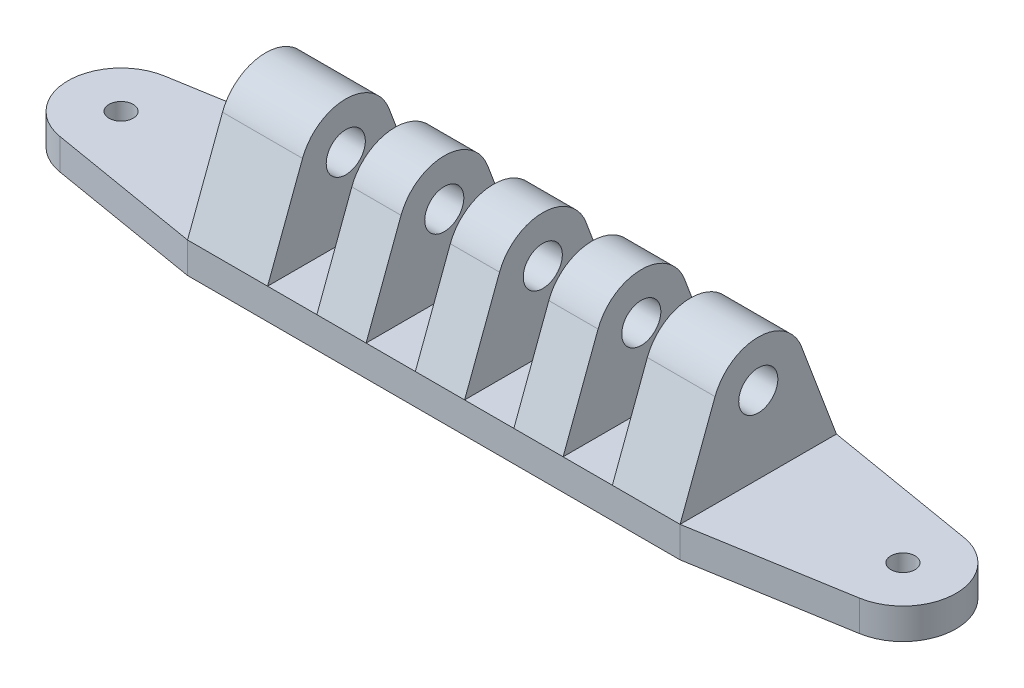
ISO-10303-21;
HEADER;
FILE_DESCRIPTION(('STEP AP214'),'2;1');
FILE_NAME('part.step','',(''),(''),'','','');
FILE_SCHEMA(('AUTOMOTIVE_DESIGN { 1 0 10303 214 1 1 1 1 }'));
ENDSEC;
DATA;
#1=APPLICATION_CONTEXT('core data for automotive mechanical design processes');
#2=APPLICATION_PROTOCOL_DEFINITION('international standard','automotive_design',2000,#1);
#3=PRODUCT_CONTEXT('',#1,'mechanical');
#4=PRODUCT('Part','Part','',(#3));
#5=PRODUCT_RELATED_PRODUCT_CATEGORY('part','',(#4));
#6=PRODUCT_DEFINITION_FORMATION('','',#4);
#7=PRODUCT_DEFINITION_CONTEXT('part definition',#1,'design');
#8=PRODUCT_DEFINITION('design','',#6,#7);
#9=PRODUCT_DEFINITION_SHAPE('','',#8);
#10=(LENGTH_UNIT() NAMED_UNIT(*) SI_UNIT(.MILLI.,.METRE.));
#11=(NAMED_UNIT(*) PLANE_ANGLE_UNIT() SI_UNIT($,.RADIAN.));
#12=(NAMED_UNIT(*) SI_UNIT($,.STERADIAN.) SOLID_ANGLE_UNIT());
#13=UNCERTAINTY_MEASURE_WITH_UNIT(LENGTH_MEASURE(1.E-05),#10,'distance_accuracy_value','');
#14=(GEOMETRIC_REPRESENTATION_CONTEXT(3) GLOBAL_UNCERTAINTY_ASSIGNED_CONTEXT((#13)) GLOBAL_UNIT_ASSIGNED_CONTEXT((#10,
#11,#12)) REPRESENTATION_CONTEXT('',''));
#15=CARTESIAN_POINT('',(0.,0.,0.));
#16=DIRECTION('',(0.,0.,1.));
#17=DIRECTION('',(1.,0.,0.));
#18=AXIS2_PLACEMENT_3D('',#15,#16,#17);
#19=CARTESIAN_POINT('',(160.,10.,-50.8));
#20=DIRECTION('',(0.,0.351258844539416,-0.9362783902947));
#21=DIRECTION('',(0.,0.9362783902947,0.351258844539416));
#22=AXIS2_PLACEMENT_3D('',#19,#20,#21);
#23=PLANE('',#22);
#24=DIRECTION('',(0.,-0.9362783902947,-0.351258844539416));
#25=VECTOR('',#24,1.);
#26=CARTESIAN_POINT('',(138.,10.,-50.8));
#27=LINE('',#26,#25);
#28=CARTESIAN_POINT('',(138.,40.2688826680912,-39.4441758544205));
#29=VERTEX_POINT('',#28);
#30=CARTESIAN_POINT('',(138.,10.,-50.8));
#31=VERTEX_POINT('',#30);
#32=EDGE_CURVE('E365',#29,#31,#27,.T.);
#33=ORIENTED_EDGE('',*,*,#32,.F.);
#34=DIRECTION('',(-1.,0.,0.));
#35=VECTOR('',#34,1.);
#36=CARTESIAN_POINT('',(160.,40.2688826680912,-39.4441758544205));
#37=LINE('',#36,#35);
#38=CARTESIAN_POINT('',(160.,40.2688826680912,-39.4441758544205));
#39=VERTEX_POINT('',#38);
#40=EDGE_CURVE('E392',#39,#29,#37,.T.);
#41=ORIENTED_EDGE('',*,*,#40,.F.);
#42=DIRECTION('',(0.,-0.9362783902947,-0.351258844539416));
#43=VECTOR('',#42,1.);
#44=CARTESIAN_POINT('',(160.,10.,-50.8));
#45=LINE('',#44,#43);
#46=CARTESIAN_POINT('',(160.,10.,-50.8));
#47=VERTEX_POINT('',#46);
#48=EDGE_CURVE('E381',#39,#47,#45,.T.);
#49=ORIENTED_EDGE('',*,*,#48,.T.);
#50=DIRECTION('',(-1.,0.,0.));
#51=VECTOR('',#50,1.);
#52=CARTESIAN_POINT('',(0.,10.,-50.8));
#53=LINE('',#52,#51);
#54=EDGE_CURVE('E408',#47,#31,#53,.T.);
#55=ORIENTED_EDGE('',*,*,#54,.T.);
#56=EDGE_LOOP('',(#33,#41,#49,#55));
#57=FACE_BOUND('',#56,.T.);
#58=ADVANCED_FACE('F37',(#57),#23,.T.);
#59=DIRECTION('',(0.,0.9362783902947,0.351258844539416));
#60=VECTOR('',#59,1.);
#61=CARTESIAN_POINT('',(122.,9.99999999999999,-50.8));
#62=LINE('',#61,#60);
#63=CARTESIAN_POINT('',(122.,10.,-50.8));
#64=VERTEX_POINT('',#63);
#65=CARTESIAN_POINT('',(122.,40.2688826680912,-39.4441758544205));
#66=VERTEX_POINT('',#65);
#67=EDGE_CURVE('E358',#64,#66,#62,.T.);
#68=ORIENTED_EDGE('',*,*,#67,.F.);
#69=CARTESIAN_POINT('',(106.,10.,-50.8));
#70=VERTEX_POINT('',#69);
#71=EDGE_CURVE('E412',#64,#70,#53,.T.);
#72=ORIENTED_EDGE('',*,*,#71,.T.);
#73=DIRECTION('',(0.,-0.9362783902947,-0.351258844539416));
#74=VECTOR('',#73,1.);
#75=CARTESIAN_POINT('',(106.,9.99999999999998,-50.8));
#76=LINE('',#75,#74);
#77=CARTESIAN_POINT('',(106.,40.2688826680912,-39.4441758544205));
#78=VERTEX_POINT('',#77);
#79=EDGE_CURVE('E351',#78,#70,#76,.T.);
#80=ORIENTED_EDGE('',*,*,#79,.F.);
#81=EDGE_CURVE('E396',#66,#78,#37,.T.);
#82=ORIENTED_EDGE('',*,*,#81,.F.);
#83=EDGE_LOOP('',(#68,#72,#80,#82));
#84=FACE_BOUND('',#83,.T.);
#85=ADVANCED_FACE('F456',(#84),#23,.T.);
#86=DIRECTION('',(0.,0.9362783902947,0.351258844539416));
#87=VECTOR('',#86,1.);
#88=CARTESIAN_POINT('',(90.,9.99999999999998,-50.8));
#89=LINE('',#88,#87);
#90=CARTESIAN_POINT('',(90.,10.,-50.8));
#91=VERTEX_POINT('',#90);
#92=CARTESIAN_POINT('',(90.,40.2688826680912,-39.4441758544205));
#93=VERTEX_POINT('',#92);
#94=EDGE_CURVE('E343',#91,#93,#89,.T.);
#95=ORIENTED_EDGE('',*,*,#94,.F.);
#96=CARTESIAN_POINT('',(74.,10.,-50.8));
#97=VERTEX_POINT('',#96);
#98=EDGE_CURVE('E510',#91,#97,#53,.T.);
#99=ORIENTED_EDGE('',*,*,#98,.T.);
#100=DIRECTION('',(0.,-0.9362783902947,-0.351258844539416));
#101=VECTOR('',#100,1.);
#102=CARTESIAN_POINT('',(74.,9.99999999999997,-50.8));
#103=LINE('',#102,#101);
#104=CARTESIAN_POINT('',(74.,40.2688826680912,-39.4441758544205));
#105=VERTEX_POINT('',#104);
#106=EDGE_CURVE('E336',#105,#97,#103,.T.);
#107=ORIENTED_EDGE('',*,*,#106,.F.);
#108=EDGE_CURVE('E525',#93,#105,#37,.T.);
#109=ORIENTED_EDGE('',*,*,#108,.F.);
#110=EDGE_LOOP('',(#95,#99,#107,#109));
#111=FACE_BOUND('',#110,.T.);
#112=ADVANCED_FACE('F463',(#111),#23,.T.);
#113=DIRECTION('',(0.,0.9362783902947,0.351258844539416));
#114=VECTOR('',#113,1.);
#115=CARTESIAN_POINT('',(58.,9.99999999999997,-50.8));
#116=LINE('',#115,#114);
#117=CARTESIAN_POINT('',(58.,10.,-50.8));
#118=VERTEX_POINT('',#117);
#119=CARTESIAN_POINT('',(58.,40.2688826680912,-39.4441758544205));
#120=VERTEX_POINT('',#119);
#121=EDGE_CURVE('E328',#118,#120,#116,.T.);
#122=ORIENTED_EDGE('',*,*,#121,.F.);
#123=CARTESIAN_POINT('',(42.,10.,-50.8));
#124=VERTEX_POINT('',#123);
#125=EDGE_CURVE('E499',#118,#124,#53,.T.);
#126=ORIENTED_EDGE('',*,*,#125,.T.);
#127=DIRECTION('',(0.,-0.9362783902947,-0.351258844539416));
#128=VECTOR('',#127,1.);
#129=CARTESIAN_POINT('',(42.,9.99999999999996,-50.8));
#130=LINE('',#129,#128);
#131=CARTESIAN_POINT('',(42.,40.2688826680912,-39.4441758544205));
#132=VERTEX_POINT('',#131);
#133=EDGE_CURVE('E320',#132,#124,#130,.T.);
#134=ORIENTED_EDGE('',*,*,#133,.F.);
#135=EDGE_CURVE('E501',#120,#132,#37,.T.);
#136=ORIENTED_EDGE('',*,*,#135,.F.);
#137=EDGE_LOOP('',(#122,#126,#134,#136));
#138=FACE_BOUND('',#137,.T.);
#139=ADVANCED_FACE('F472',(#138),#23,.T.);
#140=CARTESIAN_POINT('',(160.,35.,-25.4));
#141=DIRECTION('',(-1.,0.,0.));
#142=DIRECTION('',(0.,0.,1.));
#143=AXIS2_PLACEMENT_3D('',#140,#141,#142);
#144=CYLINDRICAL_SURFACE('',#143,15.);
#145=CARTESIAN_POINT('',(138.,35.,-25.4));
#146=DIRECTION('',(1.,0.,0.));
#147=DIRECTION('',(0.,0.,-1.));
#148=AXIS2_PLACEMENT_3D('',#145,#146,#147);
#149=CIRCLE('',#148,15.);
#150=CARTESIAN_POINT('',(138.,40.2688826680912,-11.3558241455795));
#151=VERTEX_POINT('',#150);
#152=EDGE_CURVE('E363',#151,#29,#149,.F.);
#153=ORIENTED_EDGE('',*,*,#152,.F.);
#154=DIRECTION('',(-1.,0.,0.));
#155=VECTOR('',#154,1.);
#156=CARTESIAN_POINT('',(160.,40.2688826680912,-11.3558241455795));
#157=LINE('',#156,#155);
#158=CARTESIAN_POINT('',(160.,40.2688826680912,-11.3558241455795));
#159=VERTEX_POINT('',#158);
#160=EDGE_CURVE('E398',#159,#151,#157,.T.);
#161=ORIENTED_EDGE('',*,*,#160,.F.);
#162=CARTESIAN_POINT('',(160.,35.,-25.4));
#163=DIRECTION('',(-1.,0.,0.));
#164=DIRECTION('',(0.,0.,-1.));
#165=AXIS2_PLACEMENT_3D('',#162,#163,#164);
#166=CIRCLE('',#165,15.);
#167=EDGE_CURVE('E377',#159,#39,#166,.T.);
#168=ORIENTED_EDGE('',*,*,#167,.T.);
#169=ORIENTED_EDGE('',*,*,#40,.T.);
#170=EDGE_LOOP('',(#153,#161,#168,#169));
#171=FACE_BOUND('',#170,.T.);
#172=ADVANCED_FACE('F479',(#171),#144,.T.);
#173=CARTESIAN_POINT('',(122.,40.2688826680912,-11.3558241455795));
#174=VERTEX_POINT('',#173);
#175=CARTESIAN_POINT('',(106.,40.2688826680912,-11.3558241455795));
#176=VERTEX_POINT('',#175);
#177=EDGE_CURVE('E401',#174,#176,#157,.T.);
#178=ORIENTED_EDGE('',*,*,#177,.F.);
#179=CARTESIAN_POINT('',(122.,35.,-25.4));
#180=DIRECTION('',(-1.,0.,0.));
#181=DIRECTION('',(0.,-1.,0.));
#182=AXIS2_PLACEMENT_3D('',#179,#180,#181);
#183=CIRCLE('',#182,15.);
#184=EDGE_CURVE('E356',#66,#174,#183,.F.);
#185=ORIENTED_EDGE('',*,*,#184,.F.);
#186=ORIENTED_EDGE('',*,*,#81,.T.);
#187=CARTESIAN_POINT('',(106.,35.,-25.4));
#188=DIRECTION('',(1.,0.,0.));
#189=DIRECTION('',(0.,1.,0.));
#190=AXIS2_PLACEMENT_3D('',#187,#188,#189);
#191=CIRCLE('',#190,15.);
#192=EDGE_CURVE('E349',#176,#78,#191,.F.);
#193=ORIENTED_EDGE('',*,*,#192,.F.);
#194=EDGE_LOOP('',(#178,#185,#186,#193));
#195=FACE_BOUND('',#194,.T.);
#196=ADVANCED_FACE('F491',(#195),#144,.T.);
#197=CARTESIAN_POINT('',(90.,40.2688826680912,-11.3558241455795));
#198=VERTEX_POINT('',#197);
#199=CARTESIAN_POINT('',(74.,40.2688826680912,-11.3558241455795));
#200=VERTEX_POINT('',#199);
#201=EDGE_CURVE('E559',#198,#200,#157,.T.);
#202=ORIENTED_EDGE('',*,*,#201,.F.);
#203=CARTESIAN_POINT('',(90.,35.,-25.4));
#204=DIRECTION('',(-1.,0.,0.));
#205=DIRECTION('',(0.,-1.,0.));
#206=AXIS2_PLACEMENT_3D('',#203,#204,#205);
#207=CIRCLE('',#206,15.);
#208=EDGE_CURVE('E341',#93,#198,#207,.F.);
#209=ORIENTED_EDGE('',*,*,#208,.F.);
#210=ORIENTED_EDGE('',*,*,#108,.T.);
#211=CARTESIAN_POINT('',(74.,35.,-25.4));
#212=DIRECTION('',(1.,0.,0.));
#213=DIRECTION('',(0.,1.,0.));
#214=AXIS2_PLACEMENT_3D('',#211,#212,#213);
#215=CIRCLE('',#214,15.);
#216=EDGE_CURVE('E334',#200,#105,#215,.F.);
#217=ORIENTED_EDGE('',*,*,#216,.F.);
#218=EDGE_LOOP('',(#202,#209,#210,#217));
#219=FACE_BOUND('',#218,.T.);
#220=ADVANCED_FACE('F557',(#219),#144,.T.);
#221=CARTESIAN_POINT('',(58.,40.2688826680912,-11.3558241455795));
#222=VERTEX_POINT('',#221);
#223=CARTESIAN_POINT('',(42.,40.2688826680912,-11.3558241455795));
#224=VERTEX_POINT('',#223);
#225=EDGE_CURVE('E562',#222,#224,#157,.T.);
#226=ORIENTED_EDGE('',*,*,#225,.F.);
#227=CARTESIAN_POINT('',(58.,35.,-25.4));
#228=DIRECTION('',(-1.,0.,0.));
#229=DIRECTION('',(0.,-1.,0.));
#230=AXIS2_PLACEMENT_3D('',#227,#228,#229);
#231=CIRCLE('',#230,15.);
#232=EDGE_CURVE('E326',#120,#222,#231,.F.);
#233=ORIENTED_EDGE('',*,*,#232,.F.);
#234=ORIENTED_EDGE('',*,*,#135,.T.);
#235=CARTESIAN_POINT('',(42.,35.,-25.4));
#236=DIRECTION('',(1.,0.,0.));
#237=DIRECTION('',(0.,1.,0.));
#238=AXIS2_PLACEMENT_3D('',#235,#236,#237);
#239=CIRCLE('',#238,15.);
#240=EDGE_CURVE('E318',#224,#132,#239,.F.);
#241=ORIENTED_EDGE('',*,*,#240,.F.);
#242=EDGE_LOOP('',(#226,#233,#234,#241));
#243=FACE_BOUND('',#242,.T.);
#244=ADVANCED_FACE('F480',(#243),#144,.T.);
#245=CARTESIAN_POINT('',(160.,10.,0.));
#246=DIRECTION('',(0.,0.351258844539416,0.9362783902947));
#247=DIRECTION('',(0.,-0.9362783902947,0.351258844539416));
#248=AXIS2_PLACEMENT_3D('',#245,#246,#247);
#249=PLANE('',#248);
#250=DIRECTION('',(0.,0.9362783902947,-0.351258844539416));
#251=VECTOR('',#250,1.);
#252=CARTESIAN_POINT('',(138.,10.,0.));
#253=LINE('',#252,#251);
#254=CARTESIAN_POINT('',(138.,10.,0.));
#255=VERTEX_POINT('',#254);
#256=EDGE_CURVE('E360',#255,#151,#253,.T.);
#257=ORIENTED_EDGE('',*,*,#256,.F.);
#258=DIRECTION('',(1.,0.,0.));
#259=VECTOR('',#258,1.);
#260=CARTESIAN_POINT('',(0.,10.,0.));
#261=LINE('',#260,#259);
#262=CARTESIAN_POINT('',(160.,10.,0.));
#263=VERTEX_POINT('',#262);
#264=EDGE_CURVE('E407',#255,#263,#261,.T.);
#265=ORIENTED_EDGE('',*,*,#264,.T.);
#266=DIRECTION('',(0.,0.9362783902947,-0.351258844539416));
#267=VECTOR('',#266,1.);
#268=CARTESIAN_POINT('',(160.,10.,0.));
#269=LINE('',#268,#267);
#270=EDGE_CURVE('E374',#263,#159,#269,.T.);
#271=ORIENTED_EDGE('',*,*,#270,.T.);
#272=ORIENTED_EDGE('',*,*,#160,.T.);
#273=EDGE_LOOP('',(#257,#265,#271,#272));
#274=FACE_BOUND('',#273,.T.);
#275=ADVANCED_FACE('F602',(#274),#249,.T.);
#276=DIRECTION('',(0.,-0.9362783902947,0.351258844539416));
#277=VECTOR('',#276,1.);
#278=CARTESIAN_POINT('',(122.,9.99999999999999,0.));
#279=LINE('',#278,#277);
#280=CARTESIAN_POINT('',(122.,10.,0.));
#281=VERTEX_POINT('',#280);
#282=EDGE_CURVE('E354',#174,#281,#279,.T.);
#283=ORIENTED_EDGE('',*,*,#282,.F.);
#284=ORIENTED_EDGE('',*,*,#177,.T.);
#285=DIRECTION('',(0.,0.9362783902947,-0.351258844539416));
#286=VECTOR('',#285,1.);
#287=CARTESIAN_POINT('',(106.,9.99999999999998,0.));
#288=LINE('',#287,#286);
#289=CARTESIAN_POINT('',(106.,10.,0.));
#290=VERTEX_POINT('',#289);
#291=EDGE_CURVE('E346',#290,#176,#288,.T.);
#292=ORIENTED_EDGE('',*,*,#291,.F.);
#293=EDGE_CURVE('E589',#290,#281,#261,.T.);
#294=ORIENTED_EDGE('',*,*,#293,.T.);
#295=EDGE_LOOP('',(#283,#284,#292,#294));
#296=FACE_BOUND('',#295,.T.);
#297=ADVANCED_FACE('F864',(#296),#249,.T.);
#298=DIRECTION('',(0.,-0.9362783902947,0.351258844539416));
#299=VECTOR('',#298,1.);
#300=CARTESIAN_POINT('',(90.,9.99999999999998,0.));
#301=LINE('',#300,#299);
#302=CARTESIAN_POINT('',(90.,10.,0.));
#303=VERTEX_POINT('',#302);
#304=EDGE_CURVE('E339',#198,#303,#301,.T.);
#305=ORIENTED_EDGE('',*,*,#304,.F.);
#306=ORIENTED_EDGE('',*,*,#201,.T.);
#307=DIRECTION('',(0.,0.9362783902947,-0.351258844539416));
#308=VECTOR('',#307,1.);
#309=CARTESIAN_POINT('',(74.,9.99999999999997,0.));
#310=LINE('',#309,#308);
#311=CARTESIAN_POINT('',(74.,10.,0.));
#312=VERTEX_POINT('',#311);
#313=EDGE_CURVE('E331',#312,#200,#310,.T.);
#314=ORIENTED_EDGE('',*,*,#313,.F.);
#315=EDGE_CURVE('E584',#312,#303,#261,.T.);
#316=ORIENTED_EDGE('',*,*,#315,.T.);
#317=EDGE_LOOP('',(#305,#306,#314,#316));
#318=FACE_BOUND('',#317,.T.);
#319=ADVANCED_FACE('F913',(#318),#249,.T.);
#320=DIRECTION('',(0.,-0.9362783902947,0.351258844539416));
#321=VECTOR('',#320,1.);
#322=CARTESIAN_POINT('',(58.,9.99999999999997,0.));
#323=LINE('',#322,#321);
#324=CARTESIAN_POINT('',(58.,10.,0.));
#325=VERTEX_POINT('',#324);
#326=EDGE_CURVE('E323',#222,#325,#323,.T.);
#327=ORIENTED_EDGE('',*,*,#326,.F.);
#328=ORIENTED_EDGE('',*,*,#225,.T.);
#329=DIRECTION('',(0.,0.9362783902947,-0.351258844539416));
#330=VECTOR('',#329,1.);
#331=CARTESIAN_POINT('',(42.,9.99999999999996,0.));
#332=LINE('',#331,#330);
#333=CARTESIAN_POINT('',(42.,10.,0.));
#334=VERTEX_POINT('',#333);
#335=EDGE_CURVE('E315',#334,#224,#332,.T.);
#336=ORIENTED_EDGE('',*,*,#335,.F.);
#337=EDGE_CURVE('E580',#334,#325,#261,.T.);
#338=ORIENTED_EDGE('',*,*,#337,.T.);
#339=EDGE_LOOP('',(#327,#328,#336,#338));
#340=FACE_BOUND('',#339,.T.);
#341=ADVANCED_FACE('F746',(#340),#249,.T.);
#342=CARTESIAN_POINT('',(160.,35.,-25.4));
#343=DIRECTION('',(-1.,0.,0.));
#344=DIRECTION('',(0.,0.,1.));
#345=AXIS2_PLACEMENT_3D('',#342,#343,#344);
#346=CYLINDRICAL_SURFACE('',#345,6.35);
#347=CARTESIAN_POINT('',(138.,35.,-25.4));
#348=DIRECTION('',(1.,0.,0.));
#349=DIRECTION('',(0.,0.,-1.));
#350=AXIS2_PLACEMENT_3D('',#347,#348,#349);
#351=CIRCLE('',#350,6.35);
#352=CARTESIAN_POINT('',(138.,35.,-31.75));
#353=VERTEX_POINT('',#352);
#354=EDGE_CURVE('E41',#353,#353,#351,.F.);
#355=ORIENTED_EDGE('',*,*,#354,.T.);
#356=EDGE_LOOP('',(#355));
#357=FACE_BOUND('',#356,.T.);
#358=CARTESIAN_POINT('',(160.,35.,-25.4));
#359=DIRECTION('',(-1.,0.,0.));
#360=DIRECTION('',(0.,0.,1.));
#361=AXIS2_PLACEMENT_3D('',#358,#359,#360);
#362=CIRCLE('',#361,6.35);
#363=CARTESIAN_POINT('',(160.,35.,-19.05));
#364=VERTEX_POINT('',#363);
#365=EDGE_CURVE('E368',#364,#364,#362,.T.);
#366=ORIENTED_EDGE('',*,*,#365,.F.);
#367=EDGE_LOOP('',(#366));
#368=FACE_BOUND('',#367,.T.);
#369=ADVANCED_FACE('F759',(#357,#368),#346,.F.);
#370=CARTESIAN_POINT('',(0.,10.,0.));
#371=DIRECTION('',(1.,0.,0.));
#372=DIRECTION('',(0.,0.,-1.));
#373=AXIS2_PLACEMENT_3D('',#370,#371,#372);
#374=PLANE('',#373);
#375=DIRECTION('',(0.,-0.9362783902947,-0.351258844539416));
#376=VECTOR('',#375,1.);
#377=CARTESIAN_POINT('',(0.,10.,-50.8));
#378=LINE('',#377,#376);
#379=CARTESIAN_POINT('',(0.,40.2688826680912,-39.4441758544205));
#380=VERTEX_POINT('',#379);
#381=CARTESIAN_POINT('',(0.,10.,-50.8));
#382=VERTEX_POINT('',#381);
#383=EDGE_CURVE('E378',#380,#382,#378,.T.);
#384=ORIENTED_EDGE('',*,*,#383,.T.);
#385=DIRECTION('',(0.,0.,1.));
#386=VECTOR('',#385,1.);
#387=CARTESIAN_POINT('',(0.,10.,0.));
#388=LINE('',#387,#386);
#389=CARTESIAN_POINT('',(0.,10.,0.));
#390=VERTEX_POINT('',#389);
#391=EDGE_CURVE('E233',#382,#390,#388,.T.);
#392=ORIENTED_EDGE('',*,*,#391,.T.);
#393=DIRECTION('',(0.,0.9362783902947,-0.351258844539416));
#394=VECTOR('',#393,1.);
#395=CARTESIAN_POINT('',(0.,10.,0.));
#396=LINE('',#395,#394);
#397=CARTESIAN_POINT('',(0.,40.2688826680912,-11.3558241455795));
#398=VERTEX_POINT('',#397);
#399=EDGE_CURVE('E371',#390,#398,#396,.T.);
#400=ORIENTED_EDGE('',*,*,#399,.T.);
#401=CARTESIAN_POINT('',(0.,35.,-25.4));
#402=DIRECTION('',(-1.,0.,0.));
#403=DIRECTION('',(0.,0.,-1.));
#404=AXIS2_PLACEMENT_3D('',#401,#402,#403);
#405=CIRCLE('',#404,15.);
#406=EDGE_CURVE('E387',#398,#380,#405,.T.);
#407=ORIENTED_EDGE('',*,*,#406,.T.);
#408=EDGE_LOOP('',(#384,#392,#400,#407));
#409=FACE_BOUND('',#408,.T.);
#410=CARTESIAN_POINT('',(0.,35.,-25.4));
#411=DIRECTION('',(-1.,0.,0.));
#412=DIRECTION('',(0.,0.,1.));
#413=AXIS2_PLACEMENT_3D('',#410,#411,#412);
#414=CIRCLE('',#413,6.35);
#415=CARTESIAN_POINT('',(0.,35.,-19.05));
#416=VERTEX_POINT('',#415);
#417=EDGE_CURVE('E367',#416,#416,#414,.T.);
#418=ORIENTED_EDGE('',*,*,#417,.F.);
#419=EDGE_LOOP('',(#418));
#420=FACE_BOUND('',#419,.T.);
#421=ADVANCED_FACE('F39',(#409,#420),#374,.F.);
#422=CARTESIAN_POINT('',(0.,10.,0.));
#423=DIRECTION('',(0.,0.,-1.));
#424=DIRECTION('',(-1.,0.,0.));
#425=AXIS2_PLACEMENT_3D('',#422,#423,#424);
#426=PLANE('',#425);
#427=DIRECTION('',(1.,0.,0.));
#428=VECTOR('',#427,1.);
#429=CARTESIAN_POINT('',(0.,0.,0.));
#430=LINE('',#429,#428);
#431=CARTESIAN_POINT('',(0.,0.,0.));
#432=VERTEX_POINT('',#431);
#433=CARTESIAN_POINT('',(160.,0.,0.));
#434=VERTEX_POINT('',#433);
#435=EDGE_CURVE('E395',#432,#434,#430,.T.);
#436=ORIENTED_EDGE('',*,*,#435,.T.);
#437=DIRECTION('',(0.,-1.,0.));
#438=VECTOR('',#437,1.);
#439=CARTESIAN_POINT('',(160.,10.,0.));
#440=LINE('',#439,#438);
#441=EDGE_CURVE('E46',#263,#434,#440,.T.);
#442=ORIENTED_EDGE('',*,*,#441,.F.);
#443=ORIENTED_EDGE('',*,*,#264,.F.);
#444=EDGE_CURVE('E591',#281,#255,#261,.T.);
#445=ORIENTED_EDGE('',*,*,#444,.F.);
#446=ORIENTED_EDGE('',*,*,#293,.F.);
#447=EDGE_CURVE('E549',#303,#290,#261,.T.);
#448=ORIENTED_EDGE('',*,*,#447,.F.);
#449=ORIENTED_EDGE('',*,*,#315,.F.);
#450=EDGE_CURVE('E583',#325,#312,#261,.T.);
#451=ORIENTED_EDGE('',*,*,#450,.F.);
#452=ORIENTED_EDGE('',*,*,#337,.F.);
#453=CARTESIAN_POINT('',(26.,10.,0.));
#454=VERTEX_POINT('',#453);
#455=EDGE_CURVE('E406',#454,#334,#261,.T.);
#456=ORIENTED_EDGE('',*,*,#455,.F.);
#457=EDGE_CURVE('E402',#390,#454,#261,.T.);
#458=ORIENTED_EDGE('',*,*,#457,.F.);
#459=DIRECTION('',(0.,-1.,0.));
#460=VECTOR('',#459,1.);
#461=CARTESIAN_POINT('',(0.,10.,0.));
#462=LINE('',#461,#460);
#463=EDGE_CURVE('E11',#390,#432,#462,.T.);
#464=ORIENTED_EDGE('',*,*,#463,.T.);
#465=EDGE_LOOP('',(#436,#442,#443,#445,#446,#448,#449,#451,#452,#456,#458,#464));
#466=FACE_BOUND('',#465,.T.);
#467=ADVANCED_FACE('F577',(#466),#426,.F.);
#468=CARTESIAN_POINT('',(160.,10.,0.));
#469=DIRECTION('',(-1.,0.,0.));
#470=DIRECTION('',(0.,0.,1.));
#471=AXIS2_PLACEMENT_3D('',#468,#469,#470);
#472=PLANE('',#471);
#473=ORIENTED_EDGE('',*,*,#270,.F.);
#474=DIRECTION('',(0.,0.,-1.));
#475=VECTOR('',#474,1.);
#476=CARTESIAN_POINT('',(160.,10.,0.));
#477=LINE('',#476,#475);
#478=EDGE_CURVE('E254',#263,#47,#477,.T.);
#479=ORIENTED_EDGE('',*,*,#478,.T.);
#480=ORIENTED_EDGE('',*,*,#48,.F.);
#481=ORIENTED_EDGE('',*,*,#167,.F.);
#482=EDGE_LOOP('',(#473,#479,#480,#481));
#483=FACE_BOUND('',#482,.T.);
#484=ORIENTED_EDGE('',*,*,#365,.T.);
#485=EDGE_LOOP('',(#484));
#486=FACE_BOUND('',#485,.T.);
#487=ADVANCED_FACE('F609',(#483,#486),#472,.F.);
#488=CARTESIAN_POINT('',(0.,10.,-50.8));
#489=DIRECTION('',(0.,0.,1.));
#490=DIRECTION('',(1.,0.,0.));
#491=AXIS2_PLACEMENT_3D('',#488,#489,#490);
#492=PLANE('',#491);
#493=DIRECTION('',(-1.,0.,0.));
#494=VECTOR('',#493,1.);
#495=CARTESIAN_POINT('',(0.,0.,-50.8));
#496=LINE('',#495,#494);
#497=CARTESIAN_POINT('',(160.,0.,-50.8));
#498=VERTEX_POINT('',#497);
#499=CARTESIAN_POINT('',(0.,0.,-50.8));
#500=VERTEX_POINT('',#499);
#501=EDGE_CURVE('E415',#498,#500,#496,.T.);
#502=ORIENTED_EDGE('',*,*,#501,.T.);
#503=DIRECTION('',(0.,-1.,0.));
#504=VECTOR('',#503,1.);
#505=CARTESIAN_POINT('',(0.,10.,-50.8));
#506=LINE('',#505,#504);
#507=EDGE_CURVE('E411',#382,#500,#506,.T.);
#508=ORIENTED_EDGE('',*,*,#507,.F.);
#509=CARTESIAN_POINT('',(26.,10.,-50.8));
#510=VERTEX_POINT('',#509);
#511=EDGE_CURVE('E405',#510,#382,#53,.T.);
#512=ORIENTED_EDGE('',*,*,#511,.F.);
#513=DIRECTION('',(-1.,0.,0.));
#514=VECTOR('',#513,1.);
#515=CARTESIAN_POINT('',(42.,10.,-50.8));
#516=LINE('',#515,#514);
#517=EDGE_CURVE('E277',#124,#510,#516,.T.);
#518=ORIENTED_EDGE('',*,*,#517,.F.);
#519=ORIENTED_EDGE('',*,*,#125,.F.);
#520=DIRECTION('',(-1.,0.,0.));
#521=VECTOR('',#520,1.);
#522=CARTESIAN_POINT('',(74.,10.,-50.8));
#523=LINE('',#522,#521);
#524=EDGE_CURVE('E293',#97,#118,#523,.T.);
#525=ORIENTED_EDGE('',*,*,#524,.F.);
#526=ORIENTED_EDGE('',*,*,#98,.F.);
#527=DIRECTION('',(-1.,0.,0.));
#528=VECTOR('',#527,1.);
#529=CARTESIAN_POINT('',(106.,10.,-50.8));
#530=LINE('',#529,#528);
#531=EDGE_CURVE('E286',#70,#91,#530,.T.);
#532=ORIENTED_EDGE('',*,*,#531,.F.);
#533=ORIENTED_EDGE('',*,*,#71,.F.);
#534=DIRECTION('',(-1.,0.,0.));
#535=VECTOR('',#534,1.);
#536=CARTESIAN_POINT('',(138.,10.,-50.8));
#537=LINE('',#536,#535);
#538=EDGE_CURVE('E279',#31,#64,#537,.T.);
#539=ORIENTED_EDGE('',*,*,#538,.F.);
#540=ORIENTED_EDGE('',*,*,#54,.F.);
#541=DIRECTION('',(0.,-1.,0.));
#542=VECTOR('',#541,1.);
#543=CARTESIAN_POINT('',(160.,10.,-50.8));
#544=LINE('',#543,#542);
#545=EDGE_CURVE('E419',#47,#498,#544,.T.);
#546=ORIENTED_EDGE('',*,*,#545,.T.);
#547=EDGE_LOOP('',(#502,#508,#512,#518,#519,#525,#526,#532,#533,#539,#540,#546));
#548=FACE_BOUND('',#547,.T.);
#549=ADVANCED_FACE('F481',(#548),#492,.F.);
#550=CARTESIAN_POINT('',(0.,0.,0.));
#551=DIRECTION('',(0.,-1.,0.));
#552=DIRECTION('',(0.,0.,-1.));
#553=AXIS2_PLACEMENT_3D('',#550,#551,#552);
#554=PLANE('',#553);
#555=ORIENTED_EDGE('',*,*,#435,.F.);
#556=DIRECTION('',(-0.986105834069172,0.,-0.166118283204295));
#557=VECTOR('',#556,1.);
#558=CARTESIAN_POINT('',(0.,0.,0.));
#559=LINE('',#558,#557);
#560=CARTESIAN_POINT('',(-49.8638009399252,0.,-8.40000000000006));
#561=VERTEX_POINT('',#560);
#562=EDGE_CURVE('E240',#432,#561,#559,.T.);
#563=ORIENTED_EDGE('',*,*,#562,.T.);
#564=CARTESIAN_POINT('',(-47.,0.,-25.4000000000001));
#565=DIRECTION('',(0.,-1.,0.));
#566=DIRECTION('',(0.,0.,-1.));
#567=AXIS2_PLACEMENT_3D('',#564,#565,#566);
#568=CIRCLE('',#567,17.2395288747551);
#569=CARTESIAN_POINT('',(-49.8638009399252,0.,-42.4));
#570=VERTEX_POINT('',#569);
#571=EDGE_CURVE('E218',#561,#570,#568,.T.);
#572=ORIENTED_EDGE('',*,*,#571,.T.);
#573=DIRECTION('',(0.986105834069172,0.,-0.166118283204293));
#574=VECTOR('',#573,1.);
#575=CARTESIAN_POINT('',(0.,0.,-50.8));
#576=LINE('',#575,#574);
#577=EDGE_CURVE('E235',#570,#500,#576,.T.);
#578=ORIENTED_EDGE('',*,*,#577,.T.);
#579=ORIENTED_EDGE('',*,*,#501,.F.);
#580=DIRECTION('',(0.986105834069172,0.,0.166118283204293));
#581=VECTOR('',#580,1.);
#582=CARTESIAN_POINT('',(160.,0.,-50.8));
#583=LINE('',#582,#581);
#584=CARTESIAN_POINT('',(209.863800939925,0.,-42.4));
#585=VERTEX_POINT('',#584);
#586=EDGE_CURVE('E251',#498,#585,#583,.T.);
#587=ORIENTED_EDGE('',*,*,#586,.T.);
#588=CARTESIAN_POINT('',(207.,0.,-25.4000000000001));
#589=DIRECTION('',(0.,-1.,0.));
#590=DIRECTION('',(0.,0.,1.));
#591=AXIS2_PLACEMENT_3D('',#588,#589,#590);
#592=CIRCLE('',#591,17.2395288747551);
#593=CARTESIAN_POINT('',(209.863800939925,0.,-8.40000000000006));
#594=VERTEX_POINT('',#593);
#595=EDGE_CURVE('E270',#585,#594,#592,.T.);
#596=ORIENTED_EDGE('',*,*,#595,.T.);
#597=DIRECTION('',(-0.986105834069172,0.,0.166118283204295));
#598=VECTOR('',#597,1.);
#599=CARTESIAN_POINT('',(160.,0.,0.));
#600=LINE('',#599,#598);
#601=EDGE_CURVE('E258',#594,#434,#600,.T.);
#602=ORIENTED_EDGE('',*,*,#601,.T.);
#603=EDGE_LOOP('',(#555,#563,#572,#578,#579,#587,#596,#602));
#604=FACE_BOUND('',#603,.T.);
#605=CARTESIAN_POINT('',(207.,0.,-25.4000000000001));
#606=DIRECTION('',(0.,-1.,0.));
#607=DIRECTION('',(0.,0.,1.));
#608=AXIS2_PLACEMENT_3D('',#605,#606,#607);
#609=CIRCLE('',#608,3.9243);
#610=CARTESIAN_POINT('',(207.,0.,-21.4757000000001));
#611=VERTEX_POINT('',#610);
#612=EDGE_CURVE('E246',#611,#611,#609,.T.);
#613=ORIENTED_EDGE('',*,*,#612,.F.);
#614=EDGE_LOOP('',(#613));
#615=FACE_BOUND('',#614,.T.);
#616=CARTESIAN_POINT('',(-47.,0.,-25.4000000000001));
#617=DIRECTION('',(0.,-1.,0.));
#618=DIRECTION('',(0.,0.,-1.));
#619=AXIS2_PLACEMENT_3D('',#616,#617,#618);
#620=CIRCLE('',#619,3.9243);
#621=CARTESIAN_POINT('',(-47.,0.,-29.3243000000001));
#622=VERTEX_POINT('',#621);
#623=EDGE_CURVE('E702',#622,#622,#620,.T.);
#624=ORIENTED_EDGE('',*,*,#623,.F.);
#625=EDGE_LOOP('',(#624));
#626=FACE_BOUND('',#625,.T.);
#627=ADVANCED_FACE('F470',(#604,#615,#626),#554,.T.);
#628=DIRECTION('',(0.,0.9362783902947,0.351258844539416));
#629=VECTOR('',#628,1.);
#630=CARTESIAN_POINT('',(26.,9.99999999999996,-50.8));
#631=LINE('',#630,#629);
#632=CARTESIAN_POINT('',(26.,40.2688826680912,-39.4441758544205));
#633=VERTEX_POINT('',#632);
#634=EDGE_CURVE('E312',#510,#633,#631,.T.);
#635=ORIENTED_EDGE('',*,*,#634,.F.);
#636=ORIENTED_EDGE('',*,*,#511,.T.);
#637=ORIENTED_EDGE('',*,*,#383,.F.);
#638=EDGE_CURVE('E397',#633,#380,#37,.T.);
#639=ORIENTED_EDGE('',*,*,#638,.F.);
#640=EDGE_LOOP('',(#635,#636,#637,#639));
#641=FACE_BOUND('',#640,.T.);
#642=ADVANCED_FACE('F459',(#641),#23,.T.);
#643=CARTESIAN_POINT('',(26.,40.2688826680912,-11.3558241455795));
#644=VERTEX_POINT('',#643);
#645=EDGE_CURVE('E384',#644,#398,#157,.T.);
#646=ORIENTED_EDGE('',*,*,#645,.F.);
#647=CARTESIAN_POINT('',(26.,35.,-25.4));
#648=DIRECTION('',(-1.,0.,0.));
#649=DIRECTION('',(0.,-1.,0.));
#650=AXIS2_PLACEMENT_3D('',#647,#648,#649);
#651=CIRCLE('',#650,15.);
#652=EDGE_CURVE('E310',#633,#644,#651,.F.);
#653=ORIENTED_EDGE('',*,*,#652,.F.);
#654=ORIENTED_EDGE('',*,*,#638,.T.);
#655=ORIENTED_EDGE('',*,*,#406,.F.);
#656=EDGE_LOOP('',(#646,#653,#654,#655));
#657=FACE_BOUND('',#656,.T.);
#658=ADVANCED_FACE('F469',(#657),#144,.T.);
#659=DIRECTION('',(0.,-0.9362783902947,0.351258844539416));
#660=VECTOR('',#659,1.);
#661=CARTESIAN_POINT('',(26.,9.99999999999996,0.));
#662=LINE('',#661,#660);
#663=EDGE_CURVE('E307',#644,#454,#662,.T.);
#664=ORIENTED_EDGE('',*,*,#663,.F.);
#665=ORIENTED_EDGE('',*,*,#645,.T.);
#666=ORIENTED_EDGE('',*,*,#399,.F.);
#667=ORIENTED_EDGE('',*,*,#457,.T.);
#668=EDGE_LOOP('',(#664,#665,#666,#667));
#669=FACE_BOUND('',#668,.T.);
#670=ADVANCED_FACE('F477',(#669),#249,.T.);
#671=CARTESIAN_POINT('',(26.,35.,-25.4));
#672=DIRECTION('',(-1.,0.,0.));
#673=DIRECTION('',(0.,-1.,0.));
#674=AXIS2_PLACEMENT_3D('',#671,#672,#673);
#675=CIRCLE('',#674,6.35);
#676=CARTESIAN_POINT('',(26.,28.65,-25.4));
#677=VERTEX_POINT('',#676);
#678=EDGE_CURVE('E283',#677,#677,#675,.F.);
#679=ORIENTED_EDGE('',*,*,#678,.T.);
#680=EDGE_LOOP('',(#679));
#681=FACE_BOUND('',#680,.T.);
#682=ORIENTED_EDGE('',*,*,#417,.T.);
#683=EDGE_LOOP('',(#682));
#684=FACE_BOUND('',#683,.T.);
#685=ADVANCED_FACE('F744',(#681,#684),#346,.F.);
#686=CARTESIAN_POINT('',(42.,10.,20.2));
#687=DIRECTION('',(1.,0.,0.));
#688=DIRECTION('',(0.,1.,0.));
#689=AXIS2_PLACEMENT_3D('',#686,#687,#688);
#690=PLANE('',#689);
#691=ORIENTED_EDGE('',*,*,#133,.T.);
#692=DIRECTION('',(0.,0.,-1.));
#693=VECTOR('',#692,1.);
#694=CARTESIAN_POINT('',(42.,10.,20.2));
#695=LINE('',#694,#693);
#696=EDGE_CURVE('E303',#334,#124,#695,.T.);
#697=ORIENTED_EDGE('',*,*,#696,.F.);
#698=ORIENTED_EDGE('',*,*,#335,.T.);
#699=ORIENTED_EDGE('',*,*,#240,.T.);
#700=EDGE_LOOP('',(#691,#697,#698,#699));
#701=FACE_BOUND('',#700,.T.);
#702=CARTESIAN_POINT('',(42.,35.,-25.4));
#703=DIRECTION('',(1.,0.,0.));
#704=DIRECTION('',(0.,1.,0.));
#705=AXIS2_PLACEMENT_3D('',#702,#703,#704);
#706=CIRCLE('',#705,6.35);
#707=CARTESIAN_POINT('',(42.,41.35,-25.4));
#708=VERTEX_POINT('',#707);
#709=EDGE_CURVE('E314',#708,#708,#706,.F.);
#710=ORIENTED_EDGE('',*,*,#709,.F.);
#711=EDGE_LOOP('',(#710));
#712=FACE_BOUND('',#711,.T.);
#713=ADVANCED_FACE('F757',(#701,#712),#690,.F.);
#714=CARTESIAN_POINT('',(26.,10.,20.2));
#715=DIRECTION('',(-1.,0.,0.));
#716=DIRECTION('',(0.,-1.,0.));
#717=AXIS2_PLACEMENT_3D('',#714,#715,#716);
#718=PLANE('',#717);
#719=ORIENTED_EDGE('',*,*,#634,.T.);
#720=ORIENTED_EDGE('',*,*,#652,.T.);
#721=ORIENTED_EDGE('',*,*,#663,.T.);
#722=DIRECTION('',(0.,0.,-1.));
#723=VECTOR('',#722,1.);
#724=CARTESIAN_POINT('',(26.,10.,20.2));
#725=LINE('',#724,#723);
#726=EDGE_CURVE('E297',#454,#510,#725,.T.);
#727=ORIENTED_EDGE('',*,*,#726,.T.);
#728=EDGE_LOOP('',(#719,#720,#721,#727));
#729=FACE_BOUND('',#728,.T.);
#730=ORIENTED_EDGE('',*,*,#678,.F.);
#731=EDGE_LOOP('',(#730));
#732=FACE_BOUND('',#731,.T.);
#733=ADVANCED_FACE('F573',(#729,#732),#718,.F.);
#734=CARTESIAN_POINT('',(42.,10.,20.2));
#735=DIRECTION('',(0.,-1.,0.));
#736=DIRECTION('',(0.,0.,-1.));
#737=AXIS2_PLACEMENT_3D('',#734,#735,#736);
#738=PLANE('',#737);
#739=ORIENTED_EDGE('',*,*,#455,.T.);
#740=ORIENTED_EDGE('',*,*,#696,.T.);
#741=ORIENTED_EDGE('',*,*,#517,.T.);
#742=ORIENTED_EDGE('',*,*,#726,.F.);
#743=EDGE_LOOP('',(#739,#740,#741,#742));
#744=FACE_BOUND('',#743,.T.);
#745=ADVANCED_FACE('F772',(#744),#738,.F.);
#746=CARTESIAN_POINT('',(58.,35.,-25.4));
#747=DIRECTION('',(-1.,0.,0.));
#748=DIRECTION('',(0.,-1.,0.));
#749=AXIS2_PLACEMENT_3D('',#746,#747,#748);
#750=CIRCLE('',#749,6.35);
#751=CARTESIAN_POINT('',(58.,28.65,-25.4));
#752=VERTEX_POINT('',#751);
#753=EDGE_CURVE('E322',#752,#752,#750,.F.);
#754=ORIENTED_EDGE('',*,*,#753,.T.);
#755=EDGE_LOOP('',(#754));
#756=FACE_BOUND('',#755,.T.);
#757=ORIENTED_EDGE('',*,*,#709,.T.);
#758=EDGE_LOOP('',(#757));
#759=FACE_BOUND('',#758,.T.);
#760=ADVANCED_FACE('F760',(#756,#759),#346,.F.);
#761=CARTESIAN_POINT('',(74.,10.,20.2));
#762=DIRECTION('',(1.,0.,0.));
#763=DIRECTION('',(0.,1.,0.));
#764=AXIS2_PLACEMENT_3D('',#761,#762,#763);
#765=PLANE('',#764);
#766=ORIENTED_EDGE('',*,*,#106,.T.);
#767=DIRECTION('',(0.,0.,-1.));
#768=VECTOR('',#767,1.);
#769=CARTESIAN_POINT('',(74.,10.,20.2));
#770=LINE('',#769,#768);
#771=EDGE_CURVE('E296',#312,#97,#770,.T.);
#772=ORIENTED_EDGE('',*,*,#771,.F.);
#773=ORIENTED_EDGE('',*,*,#313,.T.);
#774=ORIENTED_EDGE('',*,*,#216,.T.);
#775=EDGE_LOOP('',(#766,#772,#773,#774));
#776=FACE_BOUND('',#775,.T.);
#777=CARTESIAN_POINT('',(74.,35.,-25.4));
#778=DIRECTION('',(1.,0.,0.));
#779=DIRECTION('',(0.,1.,0.));
#780=AXIS2_PLACEMENT_3D('',#777,#778,#779);
#781=CIRCLE('',#780,6.35);
#782=CARTESIAN_POINT('',(74.,41.35,-25.4));
#783=VERTEX_POINT('',#782);
#784=EDGE_CURVE('E330',#783,#783,#781,.F.);
#785=ORIENTED_EDGE('',*,*,#784,.F.);
#786=EDGE_LOOP('',(#785));
#787=FACE_BOUND('',#786,.T.);
#788=ADVANCED_FACE('F785',(#776,#787),#765,.F.);
#789=CARTESIAN_POINT('',(58.,10.,20.2));
#790=DIRECTION('',(-1.,0.,0.));
#791=DIRECTION('',(0.,-1.,0.));
#792=AXIS2_PLACEMENT_3D('',#789,#790,#791);
#793=PLANE('',#792);
#794=ORIENTED_EDGE('',*,*,#121,.T.);
#795=ORIENTED_EDGE('',*,*,#232,.T.);
#796=ORIENTED_EDGE('',*,*,#326,.T.);
#797=DIRECTION('',(0.,0.,-1.));
#798=VECTOR('',#797,1.);
#799=CARTESIAN_POINT('',(58.,10.,20.2));
#800=LINE('',#799,#798);
#801=EDGE_CURVE('E289',#325,#118,#800,.T.);
#802=ORIENTED_EDGE('',*,*,#801,.T.);
#803=EDGE_LOOP('',(#794,#795,#796,#802));
#804=FACE_BOUND('',#803,.T.);
#805=ORIENTED_EDGE('',*,*,#753,.F.);
#806=EDGE_LOOP('',(#805));
#807=FACE_BOUND('',#806,.T.);
#808=ADVANCED_FACE('F793',(#804,#807),#793,.F.);
#809=CARTESIAN_POINT('',(74.,10.,20.2));
#810=DIRECTION('',(0.,-1.,0.));
#811=DIRECTION('',(0.,0.,-1.));
#812=AXIS2_PLACEMENT_3D('',#809,#810,#811);
#813=PLANE('',#812);
#814=ORIENTED_EDGE('',*,*,#450,.T.);
#815=ORIENTED_EDGE('',*,*,#771,.T.);
#816=ORIENTED_EDGE('',*,*,#524,.T.);
#817=ORIENTED_EDGE('',*,*,#801,.F.);
#818=EDGE_LOOP('',(#814,#815,#816,#817));
#819=FACE_BOUND('',#818,.T.);
#820=ADVANCED_FACE('F801',(#819),#813,.F.);
#821=CARTESIAN_POINT('',(90.,35.,-25.4));
#822=DIRECTION('',(-1.,0.,0.));
#823=DIRECTION('',(0.,-1.,0.));
#824=AXIS2_PLACEMENT_3D('',#821,#822,#823);
#825=CIRCLE('',#824,6.35);
#826=CARTESIAN_POINT('',(90.,28.65,-25.4));
#827=VERTEX_POINT('',#826);
#828=EDGE_CURVE('E338',#827,#827,#825,.F.);
#829=ORIENTED_EDGE('',*,*,#828,.T.);
#830=EDGE_LOOP('',(#829));
#831=FACE_BOUND('',#830,.T.);
#832=ORIENTED_EDGE('',*,*,#784,.T.);
#833=EDGE_LOOP('',(#832));
#834=FACE_BOUND('',#833,.T.);
#835=ADVANCED_FACE('F787',(#831,#834),#346,.F.);
#836=CARTESIAN_POINT('',(106.,10.,20.2));
#837=DIRECTION('',(1.,0.,0.));
#838=DIRECTION('',(0.,1.,0.));
#839=AXIS2_PLACEMENT_3D('',#836,#837,#838);
#840=PLANE('',#839);
#841=ORIENTED_EDGE('',*,*,#79,.T.);
#842=DIRECTION('',(0.,0.,-1.));
#843=VECTOR('',#842,1.);
#844=CARTESIAN_POINT('',(106.,10.,20.2));
#845=LINE('',#844,#843);
#846=EDGE_CURVE('E288',#290,#70,#845,.T.);
#847=ORIENTED_EDGE('',*,*,#846,.F.);
#848=ORIENTED_EDGE('',*,*,#291,.T.);
#849=ORIENTED_EDGE('',*,*,#192,.T.);
#850=EDGE_LOOP('',(#841,#847,#848,#849));
#851=FACE_BOUND('',#850,.T.);
#852=CARTESIAN_POINT('',(106.,35.,-25.4));
#853=DIRECTION('',(1.,0.,0.));
#854=DIRECTION('',(0.,1.,0.));
#855=AXIS2_PLACEMENT_3D('',#852,#853,#854);
#856=CIRCLE('',#855,6.35);
#857=CARTESIAN_POINT('',(106.,41.35,-25.4));
#858=VERTEX_POINT('',#857);
#859=EDGE_CURVE('E345',#858,#858,#856,.F.);
#860=ORIENTED_EDGE('',*,*,#859,.F.);
#861=EDGE_LOOP('',(#860));
#862=FACE_BOUND('',#861,.T.);
#863=ADVANCED_FACE('F542',(#851,#862),#840,.F.);
#864=CARTESIAN_POINT('',(90.,10.,20.2));
#865=DIRECTION('',(-1.,0.,0.));
#866=DIRECTION('',(0.,-1.,0.));
#867=AXIS2_PLACEMENT_3D('',#864,#865,#866);
#868=PLANE('',#867);
#869=ORIENTED_EDGE('',*,*,#94,.T.);
#870=ORIENTED_EDGE('',*,*,#208,.T.);
#871=ORIENTED_EDGE('',*,*,#304,.T.);
#872=DIRECTION('',(0.,0.,-1.));
#873=VECTOR('',#872,1.);
#874=CARTESIAN_POINT('',(90.,10.,20.2));
#875=LINE('',#874,#873);
#876=EDGE_CURVE('E62',#303,#91,#875,.T.);
#877=ORIENTED_EDGE('',*,*,#876,.T.);
#878=EDGE_LOOP('',(#869,#870,#871,#877));
#879=FACE_BOUND('',#878,.T.);
#880=ORIENTED_EDGE('',*,*,#828,.F.);
#881=EDGE_LOOP('',(#880));
#882=FACE_BOUND('',#881,.T.);
#883=ADVANCED_FACE('F553',(#879,#882),#868,.F.);
#884=CARTESIAN_POINT('',(106.,10.,20.2));
#885=DIRECTION('',(0.,-1.,0.));
#886=DIRECTION('',(0.,0.,-1.));
#887=AXIS2_PLACEMENT_3D('',#884,#885,#886);
#888=PLANE('',#887);
#889=ORIENTED_EDGE('',*,*,#447,.T.);
#890=ORIENTED_EDGE('',*,*,#846,.T.);
#891=ORIENTED_EDGE('',*,*,#531,.T.);
#892=ORIENTED_EDGE('',*,*,#876,.F.);
#893=EDGE_LOOP('',(#889,#890,#891,#892));
#894=FACE_BOUND('',#893,.T.);
#895=ADVANCED_FACE('F546',(#894),#888,.F.);
#896=CARTESIAN_POINT('',(122.,35.,-25.4));
#897=DIRECTION('',(-1.,0.,0.));
#898=DIRECTION('',(0.,-1.,0.));
#899=AXIS2_PLACEMENT_3D('',#896,#897,#898);
#900=CIRCLE('',#899,6.35);
#901=CARTESIAN_POINT('',(122.,28.65,-25.4));
#902=VERTEX_POINT('',#901);
#903=EDGE_CURVE('E353',#902,#902,#900,.F.);
#904=ORIENTED_EDGE('',*,*,#903,.T.);
#905=EDGE_LOOP('',(#904));
#906=FACE_BOUND('',#905,.T.);
#907=ORIENTED_EDGE('',*,*,#859,.T.);
#908=EDGE_LOOP('',(#907));
#909=FACE_BOUND('',#908,.T.);
#910=ADVANCED_FACE('F437',(#906,#909),#346,.F.);
#911=CARTESIAN_POINT('',(138.,10.,20.2));
#912=DIRECTION('',(1.,0.,0.));
#913=DIRECTION('',(0.,0.,-1.));
#914=AXIS2_PLACEMENT_3D('',#911,#912,#913);
#915=PLANE('',#914);
#916=ORIENTED_EDGE('',*,*,#32,.T.);
#917=DIRECTION('',(0.,0.,-1.));
#918=VECTOR('',#917,1.);
#919=CARTESIAN_POINT('',(138.,10.,20.2));
#920=LINE('',#919,#918);
#921=EDGE_CURVE('E281',#255,#31,#920,.T.);
#922=ORIENTED_EDGE('',*,*,#921,.F.);
#923=ORIENTED_EDGE('',*,*,#256,.T.);
#924=ORIENTED_EDGE('',*,*,#152,.T.);
#925=EDGE_LOOP('',(#916,#922,#923,#924));
#926=FACE_BOUND('',#925,.T.);
#927=ORIENTED_EDGE('',*,*,#354,.F.);
#928=EDGE_LOOP('',(#927));
#929=FACE_BOUND('',#928,.T.);
#930=ADVANCED_FACE('F443',(#926,#929),#915,.F.);
#931=CARTESIAN_POINT('',(122.,10.,20.2));
#932=DIRECTION('',(-1.,0.,0.));
#933=DIRECTION('',(0.,-1.,0.));
#934=AXIS2_PLACEMENT_3D('',#931,#932,#933);
#935=PLANE('',#934);
#936=ORIENTED_EDGE('',*,*,#67,.T.);
#937=ORIENTED_EDGE('',*,*,#184,.T.);
#938=ORIENTED_EDGE('',*,*,#282,.T.);
#939=DIRECTION('',(0.,0.,-1.));
#940=VECTOR('',#939,1.);
#941=CARTESIAN_POINT('',(122.,10.,20.2));
#942=LINE('',#941,#940);
#943=EDGE_CURVE('E54',#281,#64,#942,.T.);
#944=ORIENTED_EDGE('',*,*,#943,.T.);
#945=EDGE_LOOP('',(#936,#937,#938,#944));
#946=FACE_BOUND('',#945,.T.);
#947=ORIENTED_EDGE('',*,*,#903,.F.);
#948=EDGE_LOOP('',(#947));
#949=FACE_BOUND('',#948,.T.);
#950=ADVANCED_FACE('F440',(#946,#949),#935,.F.);
#951=CARTESIAN_POINT('',(138.,10.,20.2));
#952=DIRECTION('',(0.,-1.,0.));
#953=DIRECTION('',(0.,0.,-1.));
#954=AXIS2_PLACEMENT_3D('',#951,#952,#953);
#955=PLANE('',#954);
#956=ORIENTED_EDGE('',*,*,#444,.T.);
#957=ORIENTED_EDGE('',*,*,#921,.T.);
#958=ORIENTED_EDGE('',*,*,#538,.T.);
#959=ORIENTED_EDGE('',*,*,#943,.F.);
#960=EDGE_LOOP('',(#956,#957,#958,#959));
#961=FACE_BOUND('',#960,.T.);
#962=ADVANCED_FACE('F442',(#961),#955,.F.);
#963=CARTESIAN_POINT('',(160.,10.,0.));
#964=DIRECTION('',(0.166118283204295,0.,0.986105834069172));
#965=DIRECTION('',(0.986105834069172,0.,-0.166118283204295));
#966=AXIS2_PLACEMENT_3D('',#963,#964,#965);
#967=PLANE('',#966);
#968=ORIENTED_EDGE('',*,*,#601,.F.);
#969=DIRECTION('',(0.,-1.,0.));
#970=VECTOR('',#969,1.);
#971=CARTESIAN_POINT('',(209.863800939925,10.,-8.40000000000006));
#972=LINE('',#971,#970);
#973=CARTESIAN_POINT('',(209.863800939925,10.,-8.40000000000006));
#974=VERTEX_POINT('',#973);
#975=EDGE_CURVE('E275',#974,#594,#972,.T.);
#976=ORIENTED_EDGE('',*,*,#975,.F.);
#977=DIRECTION('',(-0.986105834069172,0.,0.166118283204295));
#978=VECTOR('',#977,1.);
#979=CARTESIAN_POINT('',(160.,10.,0.));
#980=LINE('',#979,#978);
#981=EDGE_CURVE('E264',#974,#263,#980,.T.);
#982=ORIENTED_EDGE('',*,*,#981,.T.);
#983=ORIENTED_EDGE('',*,*,#441,.T.);
#984=EDGE_LOOP('',(#968,#976,#982,#983));
#985=FACE_BOUND('',#984,.T.);
#986=ADVANCED_FACE('F450',(#985),#967,.T.);
#987=CARTESIAN_POINT('',(207.,10.,-25.4000000000001));
#988=DIRECTION('',(0.,-1.,0.));
#989=DIRECTION('',(0.,0.,-1.));
#990=AXIS2_PLACEMENT_3D('',#987,#988,#989);
#991=CYLINDRICAL_SURFACE('',#990,17.2395288747551);
#992=ORIENTED_EDGE('',*,*,#595,.F.);
#993=DIRECTION('',(0.,-1.,0.));
#994=VECTOR('',#993,1.);
#995=CARTESIAN_POINT('',(209.863800939925,10.,-42.4));
#996=LINE('',#995,#994);
#997=CARTESIAN_POINT('',(209.863800939925,10.,-42.4));
#998=VERTEX_POINT('',#997);
#999=EDGE_CURVE('E267',#998,#585,#996,.T.);
#1000=ORIENTED_EDGE('',*,*,#999,.F.);
#1001=CARTESIAN_POINT('',(207.,10.,-25.4000000000001));
#1002=DIRECTION('',(0.,-1.,0.));
#1003=DIRECTION('',(0.,0.,1.));
#1004=AXIS2_PLACEMENT_3D('',#1001,#1002,#1003);
#1005=CIRCLE('',#1004,17.2395288747551);
#1006=EDGE_CURVE('E261',#998,#974,#1005,.T.);
#1007=ORIENTED_EDGE('',*,*,#1006,.T.);
#1008=ORIENTED_EDGE('',*,*,#975,.T.);
#1009=EDGE_LOOP('',(#992,#1000,#1007,#1008));
#1010=FACE_BOUND('',#1009,.T.);
#1011=ADVANCED_FACE('F640',(#1010),#991,.T.);
#1012=CARTESIAN_POINT('',(160.,10.,-50.8));
#1013=DIRECTION('',(0.166118283204293,0.,-0.986105834069172));
#1014=DIRECTION('',(-0.986105834069173,0.,-0.166118283204293));
#1015=AXIS2_PLACEMENT_3D('',#1012,#1013,#1014);
#1016=PLANE('',#1015);
#1017=ORIENTED_EDGE('',*,*,#586,.F.);
#1018=ORIENTED_EDGE('',*,*,#545,.F.);
#1019=DIRECTION('',(0.986105834069172,0.,0.166118283204293));
#1020=VECTOR('',#1019,1.);
#1021=CARTESIAN_POINT('',(160.,10.,-50.8));
#1022=LINE('',#1021,#1020);
#1023=EDGE_CURVE('E257',#47,#998,#1022,.T.);
#1024=ORIENTED_EDGE('',*,*,#1023,.T.);
#1025=ORIENTED_EDGE('',*,*,#999,.T.);
#1026=EDGE_LOOP('',(#1017,#1018,#1024,#1025));
#1027=FACE_BOUND('',#1026,.T.);
#1028=ADVANCED_FACE('F636',(#1027),#1016,.T.);
#1029=CARTESIAN_POINT('',(207.,10.,-25.4000000000001));
#1030=DIRECTION('',(0.,1.,0.));
#1031=DIRECTION('',(0.,0.,1.));
#1032=AXIS2_PLACEMENT_3D('',#1029,#1030,#1031);
#1033=PLANE('',#1032);
#1034=CARTESIAN_POINT('',(207.,10.,-25.4000000000001));
#1035=DIRECTION('',(0.,-1.,0.));
#1036=DIRECTION('',(0.,0.,1.));
#1037=AXIS2_PLACEMENT_3D('',#1034,#1035,#1036);
#1038=CIRCLE('',#1037,3.9243);
#1039=CARTESIAN_POINT('',(207.,10.,-21.4757000000001));
#1040=VERTEX_POINT('',#1039);
#1041=EDGE_CURVE('E248',#1040,#1040,#1038,.T.);
#1042=ORIENTED_EDGE('',*,*,#1041,.T.);
#1043=EDGE_LOOP('',(#1042));
#1044=FACE_BOUND('',#1043,.T.);
#1045=ORIENTED_EDGE('',*,*,#478,.F.);
#1046=ORIENTED_EDGE('',*,*,#981,.F.);
#1047=ORIENTED_EDGE('',*,*,#1006,.F.);
#1048=ORIENTED_EDGE('',*,*,#1023,.F.);
#1049=EDGE_LOOP('',(#1045,#1046,#1047,#1048));
#1050=FACE_BOUND('',#1049,.T.);
#1051=ADVANCED_FACE('F626',(#1044,#1050),#1033,.T.);
#1052=CARTESIAN_POINT('',(207.,10.,-25.4000000000001));
#1053=DIRECTION('',(0.,-1.,0.));
#1054=DIRECTION('',(0.,0.,-1.));
#1055=AXIS2_PLACEMENT_3D('',#1052,#1053,#1054);
#1056=CYLINDRICAL_SURFACE('',#1055,3.9243);
#1057=ORIENTED_EDGE('',*,*,#1041,.F.);
#1058=EDGE_LOOP('',(#1057));
#1059=FACE_BOUND('',#1058,.T.);
#1060=ORIENTED_EDGE('',*,*,#612,.T.);
#1061=EDGE_LOOP('',(#1060));
#1062=FACE_BOUND('',#1061,.T.);
#1063=ADVANCED_FACE('F619',(#1059,#1062),#1056,.F.);
#1064=CARTESIAN_POINT('',(0.,10.,-50.8));
#1065=DIRECTION('',(-0.166118283204293,0.,-0.986105834069172));
#1066=DIRECTION('',(-0.986105834069173,0.,0.166118283204293));
#1067=AXIS2_PLACEMENT_3D('',#1064,#1065,#1066);
#1068=PLANE('',#1067);
#1069=ORIENTED_EDGE('',*,*,#577,.F.);
#1070=DIRECTION('',(0.,-1.,0.));
#1071=VECTOR('',#1070,1.);
#1072=CARTESIAN_POINT('',(-49.8638009399252,10.,-42.4));
#1073=LINE('',#1072,#1071);
#1074=CARTESIAN_POINT('',(-49.8638009399252,10.,-42.4));
#1075=VERTEX_POINT('',#1074);
#1076=EDGE_CURVE('E222',#1075,#570,#1073,.T.);
#1077=ORIENTED_EDGE('',*,*,#1076,.F.);
#1078=DIRECTION('',(0.986105834069172,0.,-0.166118283204293));
#1079=VECTOR('',#1078,1.);
#1080=CARTESIAN_POINT('',(0.,10.,-50.8));
#1081=LINE('',#1080,#1079);
#1082=EDGE_CURVE('E223',#1075,#382,#1081,.T.);
#1083=ORIENTED_EDGE('',*,*,#1082,.T.);
#1084=ORIENTED_EDGE('',*,*,#507,.T.);
#1085=EDGE_LOOP('',(#1069,#1077,#1083,#1084));
#1086=FACE_BOUND('',#1085,.T.);
#1087=ADVANCED_FACE('F617',(#1086),#1068,.T.);
#1088=CARTESIAN_POINT('',(-47.,10.,-25.4000000000001));
#1089=DIRECTION('',(0.,-1.,0.));
#1090=DIRECTION('',(0.,0.,-1.));
#1091=AXIS2_PLACEMENT_3D('',#1088,#1089,#1090);
#1092=CYLINDRICAL_SURFACE('',#1091,17.2395288747551);
#1093=ORIENTED_EDGE('',*,*,#571,.F.);
#1094=DIRECTION('',(0.,-1.,0.));
#1095=VECTOR('',#1094,1.);
#1096=CARTESIAN_POINT('',(-49.8638009399252,10.,-8.40000000000006));
#1097=LINE('',#1096,#1095);
#1098=CARTESIAN_POINT('',(-49.8638009399252,10.,-8.40000000000006));
#1099=VERTEX_POINT('',#1098);
#1100=EDGE_CURVE('E212',#1099,#561,#1097,.T.);
#1101=ORIENTED_EDGE('',*,*,#1100,.F.);
#1102=CARTESIAN_POINT('',(-47.,10.,-25.4000000000001));
#1103=DIRECTION('',(0.,-1.,0.));
#1104=DIRECTION('',(0.,0.,-1.));
#1105=AXIS2_PLACEMENT_3D('',#1102,#1103,#1104);
#1106=CIRCLE('',#1105,17.2395288747551);
#1107=EDGE_CURVE('E215',#1099,#1075,#1106,.T.);
#1108=ORIENTED_EDGE('',*,*,#1107,.T.);
#1109=ORIENTED_EDGE('',*,*,#1076,.T.);
#1110=EDGE_LOOP('',(#1093,#1101,#1108,#1109));
#1111=FACE_BOUND('',#1110,.T.);
#1112=ADVANCED_FACE('F214',(#1111),#1092,.T.);
#1113=CARTESIAN_POINT('',(0.,10.,0.));
#1114=DIRECTION('',(-0.166118283204295,0.,0.986105834069172));
#1115=DIRECTION('',(0.986105834069172,0.,0.166118283204295));
#1116=AXIS2_PLACEMENT_3D('',#1113,#1114,#1115);
#1117=PLANE('',#1116);
#1118=ORIENTED_EDGE('',*,*,#562,.F.);
#1119=ORIENTED_EDGE('',*,*,#463,.F.);
#1120=DIRECTION('',(-0.986105834069172,0.,-0.166118283204295));
#1121=VECTOR('',#1120,1.);
#1122=CARTESIAN_POINT('',(0.,10.,0.));
#1123=LINE('',#1122,#1121);
#1124=EDGE_CURVE('E227',#390,#1099,#1123,.T.);
#1125=ORIENTED_EDGE('',*,*,#1124,.T.);
#1126=ORIENTED_EDGE('',*,*,#1100,.T.);
#1127=EDGE_LOOP('',(#1118,#1119,#1125,#1126));
#1128=FACE_BOUND('',#1127,.T.);
#1129=ADVANCED_FACE('F231',(#1128),#1117,.T.);
#1130=CARTESIAN_POINT('',(-47.,10.,-25.4000000000001));
#1131=DIRECTION('',(0.,-1.,0.));
#1132=DIRECTION('',(0.,0.,-1.));
#1133=AXIS2_PLACEMENT_3D('',#1130,#1131,#1132);
#1134=PLANE('',#1133);
#1135=CARTESIAN_POINT('',(-47.,10.,-25.4000000000001));
#1136=DIRECTION('',(0.,-1.,0.));
#1137=DIRECTION('',(0.,0.,-1.));
#1138=AXIS2_PLACEMENT_3D('',#1135,#1136,#1137);
#1139=CIRCLE('',#1138,3.9243);
#1140=CARTESIAN_POINT('',(-47.,10.,-29.3243000000001));
#1141=VERTEX_POINT('',#1140);
#1142=EDGE_CURVE('E242',#1141,#1141,#1139,.T.);
#1143=ORIENTED_EDGE('',*,*,#1142,.T.);
#1144=EDGE_LOOP('',(#1143));
#1145=FACE_BOUND('',#1144,.T.);
#1146=ORIENTED_EDGE('',*,*,#391,.F.);
#1147=ORIENTED_EDGE('',*,*,#1082,.F.);
#1148=ORIENTED_EDGE('',*,*,#1107,.F.);
#1149=ORIENTED_EDGE('',*,*,#1124,.F.);
#1150=EDGE_LOOP('',(#1146,#1147,#1148,#1149));
#1151=FACE_BOUND('',#1150,.T.);
#1152=ADVANCED_FACE('F226',(#1145,#1151),#1134,.F.);
#1153=CARTESIAN_POINT('',(-47.,10.,-25.4000000000001));
#1154=DIRECTION('',(0.,-1.,0.));
#1155=DIRECTION('',(0.,0.,-1.));
#1156=AXIS2_PLACEMENT_3D('',#1153,#1154,#1155);
#1157=CYLINDRICAL_SURFACE('',#1156,3.9243);
#1158=ORIENTED_EDGE('',*,*,#1142,.F.);
#1159=EDGE_LOOP('',(#1158));
#1160=FACE_BOUND('',#1159,.T.);
#1161=ORIENTED_EDGE('',*,*,#623,.T.);
#1162=EDGE_LOOP('',(#1161));
#1163=FACE_BOUND('',#1162,.T.);
#1164=ADVANCED_FACE('F685',(#1160,#1163),#1157,.F.);
#1165=CLOSED_SHELL('',(#58,#85,#112,#139,#172,#196,#220,#244,#275,#297,#319,#341,#369,#421,#467,
#487,#549,#627,#642,#658,#670,#685,#713,#733,#745,#760,#788,#808,#820,#835,#863,#883,#895,#910,
#930,#950,#962,#986,#1011,#1028,#1051,#1063,#1087,#1112,#1129,#1152,#1164));
#1166=MANIFOLD_SOLID_BREP('B2',#1165);
#1167=ADVANCED_BREP_SHAPE_REPRESENTATION('',(#18,#1166),#14);
#1168=SHAPE_DEFINITION_REPRESENTATION(#9,#1167);
ENDSEC;
END-ISO-10303-21;
